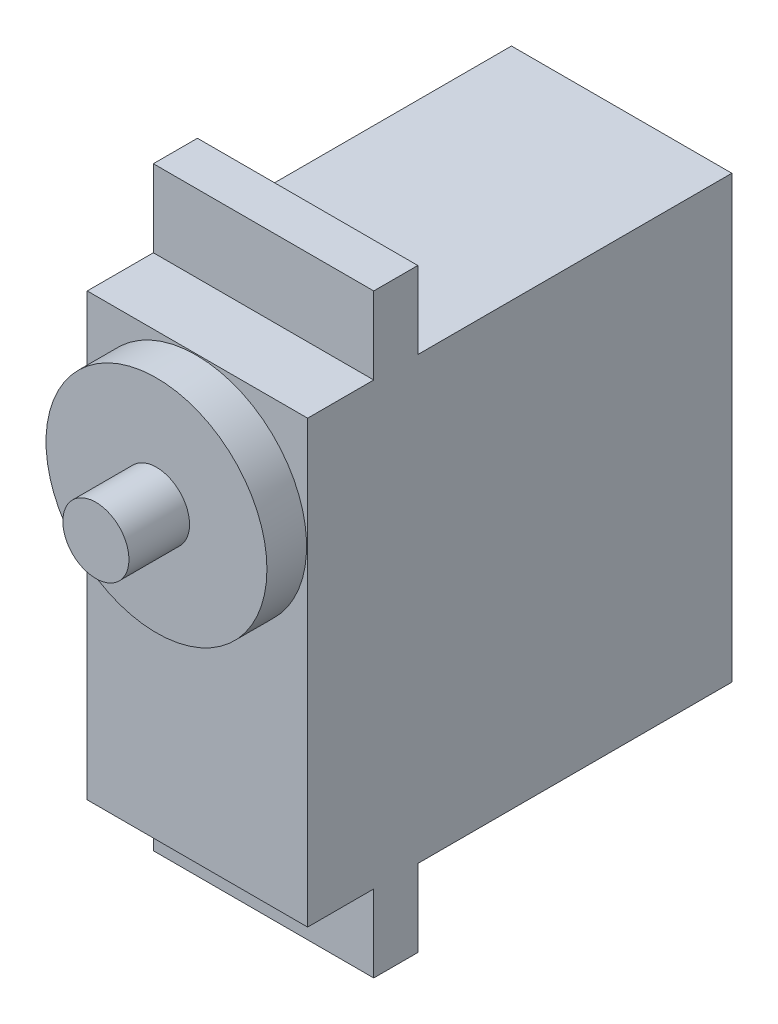
ISO-10303-21;
HEADER;
FILE_DESCRIPTION(('STEP AP214'),'2;1');
FILE_NAME('part.step','',(''),(''),'','','');
FILE_SCHEMA(('AUTOMOTIVE_DESIGN { 1 0 10303 214 1 1 1 1 }'));
ENDSEC;
DATA;
#1=APPLICATION_CONTEXT('core data for automotive mechanical design processes');
#2=APPLICATION_PROTOCOL_DEFINITION('international standard','automotive_design',2000,#1);
#3=PRODUCT_CONTEXT('',#1,'mechanical');
#4=PRODUCT('Part','Part','',(#3));
#5=PRODUCT_RELATED_PRODUCT_CATEGORY('part','',(#4));
#6=PRODUCT_DEFINITION_FORMATION('','',#4);
#7=PRODUCT_DEFINITION_CONTEXT('part definition',#1,'design');
#8=PRODUCT_DEFINITION('design','',#6,#7);
#9=PRODUCT_DEFINITION_SHAPE('','',#8);
#10=(LENGTH_UNIT() NAMED_UNIT(*) SI_UNIT(.MILLI.,.METRE.));
#11=(NAMED_UNIT(*) PLANE_ANGLE_UNIT() SI_UNIT($,.RADIAN.));
#12=(NAMED_UNIT(*) SI_UNIT($,.STERADIAN.) SOLID_ANGLE_UNIT());
#13=UNCERTAINTY_MEASURE_WITH_UNIT(LENGTH_MEASURE(1.E-05),#10,'distance_accuracy_value','');
#14=(GEOMETRIC_REPRESENTATION_CONTEXT(3) GLOBAL_UNCERTAINTY_ASSIGNED_CONTEXT((#13)) GLOBAL_UNIT_ASSIGNED_CONTEXT((#10,
#11,#12)) REPRESENTATION_CONTEXT('',''));
#15=CARTESIAN_POINT('',(0.,0.,0.));
#16=DIRECTION('',(0.,0.,1.));
#17=DIRECTION('',(1.,0.,0.));
#18=AXIS2_PLACEMENT_3D('',#15,#16,#17);
#19=CARTESIAN_POINT('',(0.,0.,0.));
#20=DIRECTION('',(0.,0.,1.));
#21=DIRECTION('',(1.,0.,0.));
#22=AXIS2_PLACEMENT_3D('',#19,#20,#21);
#23=PLANE('',#22);
#24=DIRECTION('',(-1.,0.,0.));
#25=VECTOR('',#24,1.);
#26=CARTESIAN_POINT('',(-9.99999999999999,-20.,0.));
#27=LINE('',#26,#25);
#28=CARTESIAN_POINT('',(10.,-20.,0.));
#29=VERTEX_POINT('',#28);
#30=CARTESIAN_POINT('',(-9.99999999999999,-20.,0.));
#31=VERTEX_POINT('',#30);
#32=EDGE_CURVE('E164',#29,#31,#27,.T.);
#33=ORIENTED_EDGE('',*,*,#32,.F.);
#34=DIRECTION('',(0.,1.,0.));
#35=VECTOR('',#34,1.);
#36=CARTESIAN_POINT('',(10.,-27.,0.));
#37=LINE('',#36,#35);
#38=CARTESIAN_POINT('',(10.,-27.,0.));
#39=VERTEX_POINT('',#38);
#40=EDGE_CURVE('E232',#39,#29,#37,.T.);
#41=ORIENTED_EDGE('',*,*,#40,.F.);
#42=DIRECTION('',(1.,0.,0.));
#43=VECTOR('',#42,1.);
#44=CARTESIAN_POINT('',(-9.99999999999999,-27.,0.));
#45=LINE('',#44,#43);
#46=CARTESIAN_POINT('',(-9.99999999999999,-27.,0.));
#47=VERTEX_POINT('',#46);
#48=EDGE_CURVE('E249',#47,#39,#45,.T.);
#49=ORIENTED_EDGE('',*,*,#48,.F.);
#50=DIRECTION('',(0.,-1.,0.));
#51=VECTOR('',#50,1.);
#52=CARTESIAN_POINT('',(-9.99999999999999,-27.,0.));
#53=LINE('',#52,#51);
#54=EDGE_CURVE('E63',#31,#47,#53,.T.);
#55=ORIENTED_EDGE('',*,*,#54,.F.);
#56=EDGE_LOOP('',(#33,#41,#49,#55));
#57=FACE_BOUND('',#56,.T.);
#58=ADVANCED_FACE('F45',(#57),#23,.F.);
#59=DIRECTION('',(1.,0.,0.));
#60=VECTOR('',#59,1.);
#61=CARTESIAN_POINT('',(-9.99999999999999,20.,0.));
#62=LINE('',#61,#60);
#63=CARTESIAN_POINT('',(-9.99999999999999,20.,0.));
#64=VERTEX_POINT('',#63);
#65=CARTESIAN_POINT('',(10.,20.,0.));
#66=VERTEX_POINT('',#65);
#67=EDGE_CURVE('E71',#64,#66,#62,.T.);
#68=ORIENTED_EDGE('',*,*,#67,.F.);
#69=CARTESIAN_POINT('',(-9.99999999999999,27.,0.));
#70=VERTEX_POINT('',#69);
#71=EDGE_CURVE('E168',#70,#64,#53,.T.);
#72=ORIENTED_EDGE('',*,*,#71,.F.);
#73=DIRECTION('',(-1.,0.,0.));
#74=VECTOR('',#73,1.);
#75=CARTESIAN_POINT('',(-9.99999999999999,27.,0.));
#76=LINE('',#75,#74);
#77=CARTESIAN_POINT('',(10.,27.,0.));
#78=VERTEX_POINT('',#77);
#79=EDGE_CURVE('E226',#78,#70,#76,.T.);
#80=ORIENTED_EDGE('',*,*,#79,.F.);
#81=EDGE_CURVE('E252',#66,#78,#37,.T.);
#82=ORIENTED_EDGE('',*,*,#81,.F.);
#83=EDGE_LOOP('',(#68,#72,#80,#82));
#84=FACE_BOUND('',#83,.T.);
#85=ADVANCED_FACE('F325',(#84),#23,.F.);
#86=CARTESIAN_POINT('',(0.,0.,4.));
#87=DIRECTION('',(0.,0.,1.));
#88=DIRECTION('',(1.,0.,0.));
#89=AXIS2_PLACEMENT_3D('',#86,#87,#88);
#90=PLANE('',#89);
#91=DIRECTION('',(-1.,0.,0.));
#92=VECTOR('',#91,1.);
#93=CARTESIAN_POINT('',(-9.99999999999999,20.,4.));
#94=LINE('',#93,#92);
#95=CARTESIAN_POINT('',(10.,20.,4.));
#96=VERTEX_POINT('',#95);
#97=CARTESIAN_POINT('',(-9.99999999999999,20.,4.));
#98=VERTEX_POINT('',#97);
#99=EDGE_CURVE('E207',#96,#98,#94,.T.);
#100=ORIENTED_EDGE('',*,*,#99,.F.);
#101=DIRECTION('',(0.,1.,0.));
#102=VECTOR('',#101,1.);
#103=CARTESIAN_POINT('',(10.,-27.,4.));
#104=LINE('',#103,#102);
#105=CARTESIAN_POINT('',(10.,27.,4.));
#106=VERTEX_POINT('',#105);
#107=EDGE_CURVE('E239',#96,#106,#104,.T.);
#108=ORIENTED_EDGE('',*,*,#107,.T.);
#109=DIRECTION('',(-1.,0.,0.));
#110=VECTOR('',#109,1.);
#111=CARTESIAN_POINT('',(-9.99999999999999,27.,4.));
#112=LINE('',#111,#110);
#113=CARTESIAN_POINT('',(-9.99999999999999,27.,4.));
#114=VERTEX_POINT('',#113);
#115=EDGE_CURVE('E227',#106,#114,#112,.T.);
#116=ORIENTED_EDGE('',*,*,#115,.T.);
#117=DIRECTION('',(0.,-1.,0.));
#118=VECTOR('',#117,1.);
#119=CARTESIAN_POINT('',(-9.99999999999999,-27.,4.));
#120=LINE('',#119,#118);
#121=EDGE_CURVE('E233',#114,#98,#120,.T.);
#122=ORIENTED_EDGE('',*,*,#121,.T.);
#123=EDGE_LOOP('',(#100,#108,#116,#122));
#124=FACE_BOUND('',#123,.T.);
#125=ADVANCED_FACE('F331',(#124),#90,.T.);
#126=CARTESIAN_POINT('',(-9.99999999999999,27.,4.));
#127=DIRECTION('',(0.,-1.,0.));
#128=DIRECTION('',(1.,0.,0.));
#129=AXIS2_PLACEMENT_3D('',#126,#127,#128);
#130=PLANE('',#129);
#131=ORIENTED_EDGE('',*,*,#79,.T.);
#132=DIRECTION('',(0.,0.,-1.));
#133=VECTOR('',#132,1.);
#134=CARTESIAN_POINT('',(-9.99999999999999,27.,4.));
#135=LINE('',#134,#133);
#136=EDGE_CURVE('E49',#114,#70,#135,.T.);
#137=ORIENTED_EDGE('',*,*,#136,.F.);
#138=ORIENTED_EDGE('',*,*,#115,.F.);
#139=DIRECTION('',(0.,0.,-1.));
#140=VECTOR('',#139,1.);
#141=CARTESIAN_POINT('',(10.,27.,4.));
#142=LINE('',#141,#140);
#143=EDGE_CURVE('E243',#106,#78,#142,.T.);
#144=ORIENTED_EDGE('',*,*,#143,.T.);
#145=EDGE_LOOP('',(#131,#137,#138,#144));
#146=FACE_BOUND('',#145,.T.);
#147=ADVANCED_FACE('F47',(#146),#130,.F.);
#148=CARTESIAN_POINT('',(-9.99999999999999,-27.,4.));
#149=DIRECTION('',(1.,0.,0.));
#150=DIRECTION('',(0.,0.,-1.));
#151=AXIS2_PLACEMENT_3D('',#148,#149,#150);
#152=PLANE('',#151);
#153=ORIENTED_EDGE('',*,*,#71,.T.);
#154=DIRECTION('',(0.,0.,1.));
#155=VECTOR('',#154,1.);
#156=CARTESIAN_POINT('',(-9.99999999999999,20.,-28.5));
#157=LINE('',#156,#155);
#158=CARTESIAN_POINT('',(-9.99999999999999,20.,-28.5));
#159=VERTEX_POINT('',#158);
#160=EDGE_CURVE('E147',#159,#64,#157,.T.);
#161=ORIENTED_EDGE('',*,*,#160,.F.);
#162=DIRECTION('',(0.,1.,0.));
#163=VECTOR('',#162,1.);
#164=CARTESIAN_POINT('',(-9.99999999999999,-20.,-28.5));
#165=LINE('',#164,#163);
#166=CARTESIAN_POINT('',(-9.99999999999999,-20.,-28.5));
#167=VERTEX_POINT('',#166);
#168=EDGE_CURVE('E154',#167,#159,#165,.T.);
#169=ORIENTED_EDGE('',*,*,#168,.F.);
#170=DIRECTION('',(0.,0.,1.));
#171=VECTOR('',#170,1.);
#172=CARTESIAN_POINT('',(-9.99999999999999,-20.,-28.5));
#173=LINE('',#172,#171);
#174=EDGE_CURVE('E296',#167,#31,#173,.T.);
#175=ORIENTED_EDGE('',*,*,#174,.T.);
#176=ORIENTED_EDGE('',*,*,#54,.T.);
#177=DIRECTION('',(0.,0.,-1.));
#178=VECTOR('',#177,1.);
#179=CARTESIAN_POINT('',(-9.99999999999999,-27.,4.));
#180=LINE('',#179,#178);
#181=CARTESIAN_POINT('',(-9.99999999999999,-27.,4.));
#182=VERTEX_POINT('',#181);
#183=EDGE_CURVE('E262',#182,#47,#180,.T.);
#184=ORIENTED_EDGE('',*,*,#183,.F.);
#185=CARTESIAN_POINT('',(-9.99999999999999,-20.,4.));
#186=VERTEX_POINT('',#185);
#187=EDGE_CURVE('E231',#186,#182,#120,.T.);
#188=ORIENTED_EDGE('',*,*,#187,.F.);
#189=DIRECTION('',(0.,0.,-1.));
#190=VECTOR('',#189,1.);
#191=CARTESIAN_POINT('',(-9.99999999999999,-20.,10.));
#192=LINE('',#191,#190);
#193=CARTESIAN_POINT('',(-9.99999999999999,-20.,10.));
#194=VERTEX_POINT('',#193);
#195=EDGE_CURVE('E222',#194,#186,#192,.T.);
#196=ORIENTED_EDGE('',*,*,#195,.F.);
#197=DIRECTION('',(0.,-1.,0.));
#198=VECTOR('',#197,1.);
#199=CARTESIAN_POINT('',(-9.99999999999999,20.,10.));
#200=LINE('',#199,#198);
#201=CARTESIAN_POINT('',(-9.99999999999999,8.21388537958543,10.));
#202=VERTEX_POINT('',#201);
#203=EDGE_CURVE('E194',#202,#194,#200,.T.);
#204=ORIENTED_EDGE('',*,*,#203,.F.);
#205=CARTESIAN_POINT('',(-9.99999999999999,11.5549903092419,10.));
#206=VERTEX_POINT('',#205);
#207=EDGE_CURVE('E193',#206,#202,#200,.T.);
#208=ORIENTED_EDGE('',*,*,#207,.F.);
#209=CARTESIAN_POINT('',(-9.99999999999999,20.,10.));
#210=VERTEX_POINT('',#209);
#211=EDGE_CURVE('E189',#210,#206,#200,.T.);
#212=ORIENTED_EDGE('',*,*,#211,.F.);
#213=DIRECTION('',(0.,0.,-1.));
#214=VECTOR('',#213,1.);
#215=CARTESIAN_POINT('',(-9.99999999999999,20.,10.));
#216=LINE('',#215,#214);
#217=EDGE_CURVE('E203',#210,#98,#216,.T.);
#218=ORIENTED_EDGE('',*,*,#217,.T.);
#219=ORIENTED_EDGE('',*,*,#121,.F.);
#220=ORIENTED_EDGE('',*,*,#136,.T.);
#221=EDGE_LOOP('',(#153,#161,#169,#175,#176,#184,#188,#196,#204,#208,#212,#218,#219,#220));
#222=FACE_BOUND('',#221,.T.);
#223=ADVANCED_FACE('F166',(#222),#152,.F.);
#224=CARTESIAN_POINT('',(-9.99999999999999,-27.,4.));
#225=DIRECTION('',(0.,1.,0.));
#226=DIRECTION('',(-1.,0.,0.));
#227=AXIS2_PLACEMENT_3D('',#224,#225,#226);
#228=PLANE('',#227);
#229=ORIENTED_EDGE('',*,*,#48,.T.);
#230=DIRECTION('',(0.,0.,-1.));
#231=VECTOR('',#230,1.);
#232=CARTESIAN_POINT('',(10.,-27.,4.));
#233=LINE('',#232,#231);
#234=CARTESIAN_POINT('',(10.,-27.,4.));
#235=VERTEX_POINT('',#234);
#236=EDGE_CURVE('E259',#235,#39,#233,.T.);
#237=ORIENTED_EDGE('',*,*,#236,.F.);
#238=DIRECTION('',(1.,0.,0.));
#239=VECTOR('',#238,1.);
#240=CARTESIAN_POINT('',(-9.99999999999999,-27.,4.));
#241=LINE('',#240,#239);
#242=EDGE_CURVE('E236',#182,#235,#241,.T.);
#243=ORIENTED_EDGE('',*,*,#242,.F.);
#244=ORIENTED_EDGE('',*,*,#183,.T.);
#245=EDGE_LOOP('',(#229,#237,#243,#244));
#246=FACE_BOUND('',#245,.T.);
#247=ADVANCED_FACE('F338',(#246),#228,.F.);
#248=CARTESIAN_POINT('',(10.,-27.,4.));
#249=DIRECTION('',(-1.,0.,0.));
#250=DIRECTION('',(0.,0.,1.));
#251=AXIS2_PLACEMENT_3D('',#248,#249,#250);
#252=PLANE('',#251);
#253=ORIENTED_EDGE('',*,*,#40,.T.);
#254=DIRECTION('',(0.,0.,1.));
#255=VECTOR('',#254,1.);
#256=CARTESIAN_POINT('',(10.,-20.,-28.5));
#257=LINE('',#256,#255);
#258=CARTESIAN_POINT('',(10.,-20.,-28.5));
#259=VERTEX_POINT('',#258);
#260=EDGE_CURVE('E177',#259,#29,#257,.T.);
#261=ORIENTED_EDGE('',*,*,#260,.F.);
#262=DIRECTION('',(0.,-1.,0.));
#263=VECTOR('',#262,1.);
#264=CARTESIAN_POINT('',(10.,-20.,-28.5));
#265=LINE('',#264,#263);
#266=CARTESIAN_POINT('',(10.,20.,-28.5));
#267=VERTEX_POINT('',#266);
#268=EDGE_CURVE('E153',#267,#259,#265,.T.);
#269=ORIENTED_EDGE('',*,*,#268,.F.);
#270=DIRECTION('',(0.,0.,1.));
#271=VECTOR('',#270,1.);
#272=CARTESIAN_POINT('',(10.,20.,-28.5));
#273=LINE('',#272,#271);
#274=EDGE_CURVE('E149',#267,#66,#273,.T.);
#275=ORIENTED_EDGE('',*,*,#274,.T.);
#276=ORIENTED_EDGE('',*,*,#81,.T.);
#277=ORIENTED_EDGE('',*,*,#143,.F.);
#278=ORIENTED_EDGE('',*,*,#107,.F.);
#279=DIRECTION('',(0.,0.,-1.));
#280=VECTOR('',#279,1.);
#281=CARTESIAN_POINT('',(10.,20.,10.));
#282=LINE('',#281,#280);
#283=CARTESIAN_POINT('',(10.,20.,10.));
#284=VERTEX_POINT('',#283);
#285=EDGE_CURVE('E214',#284,#96,#282,.T.);
#286=ORIENTED_EDGE('',*,*,#285,.F.);
#287=DIRECTION('',(0.,1.,0.));
#288=VECTOR('',#287,1.);
#289=CARTESIAN_POINT('',(10.,20.,10.));
#290=LINE('',#289,#288);
#291=CARTESIAN_POINT('',(10.,-20.,10.));
#292=VERTEX_POINT('',#291);
#293=EDGE_CURVE('E197',#292,#284,#290,.T.);
#294=ORIENTED_EDGE('',*,*,#293,.F.);
#295=DIRECTION('',(0.,0.,-1.));
#296=VECTOR('',#295,1.);
#297=CARTESIAN_POINT('',(10.,-20.,10.));
#298=LINE('',#297,#296);
#299=CARTESIAN_POINT('',(10.,-20.,4.));
#300=VERTEX_POINT('',#299);
#301=EDGE_CURVE('E218',#292,#300,#298,.T.);
#302=ORIENTED_EDGE('',*,*,#301,.T.);
#303=EDGE_CURVE('E240',#235,#300,#104,.T.);
#304=ORIENTED_EDGE('',*,*,#303,.F.);
#305=ORIENTED_EDGE('',*,*,#236,.T.);
#306=EDGE_LOOP('',(#253,#261,#269,#275,#276,#277,#278,#286,#294,#302,#304,#305));
#307=FACE_BOUND('',#306,.T.);
#308=ADVANCED_FACE('F312',(#307),#252,.F.);
#309=DIRECTION('',(1.,0.,0.));
#310=VECTOR('',#309,1.);
#311=CARTESIAN_POINT('',(-9.99999999999999,-20.,4.));
#312=LINE('',#311,#310);
#313=EDGE_CURVE('E185',#186,#300,#312,.T.);
#314=ORIENTED_EDGE('',*,*,#313,.F.);
#315=ORIENTED_EDGE('',*,*,#187,.T.);
#316=ORIENTED_EDGE('',*,*,#242,.T.);
#317=ORIENTED_EDGE('',*,*,#303,.T.);
#318=EDGE_LOOP('',(#314,#315,#316,#317));
#319=FACE_BOUND('',#318,.T.);
#320=ADVANCED_FACE('F334',(#319),#90,.T.);
#321=CARTESIAN_POINT('',(-9.99999999999999,-20.,10.));
#322=DIRECTION('',(0.,1.,0.));
#323=DIRECTION('',(0.,0.,1.));
#324=AXIS2_PLACEMENT_3D('',#321,#322,#323);
#325=PLANE('',#324);
#326=ORIENTED_EDGE('',*,*,#313,.T.);
#327=ORIENTED_EDGE('',*,*,#301,.F.);
#328=DIRECTION('',(1.,0.,0.));
#329=VECTOR('',#328,1.);
#330=CARTESIAN_POINT('',(-9.99999999999999,-20.,10.));
#331=LINE('',#330,#329);
#332=EDGE_CURVE('E192',#194,#292,#331,.T.);
#333=ORIENTED_EDGE('',*,*,#332,.F.);
#334=ORIENTED_EDGE('',*,*,#195,.T.);
#335=EDGE_LOOP('',(#326,#327,#333,#334));
#336=FACE_BOUND('',#335,.T.);
#337=ADVANCED_FACE('F289',(#336),#325,.F.);
#338=CARTESIAN_POINT('',(-9.99999999999999,20.,10.));
#339=DIRECTION('',(0.,-1.,0.));
#340=DIRECTION('',(0.,0.,-1.));
#341=AXIS2_PLACEMENT_3D('',#338,#339,#340);
#342=PLANE('',#341);
#343=ORIENTED_EDGE('',*,*,#99,.T.);
#344=ORIENTED_EDGE('',*,*,#217,.F.);
#345=DIRECTION('',(-1.,0.,0.));
#346=VECTOR('',#345,1.);
#347=CARTESIAN_POINT('',(-9.99999999999999,20.,10.));
#348=LINE('',#347,#346);
#349=EDGE_CURVE('E200',#284,#210,#348,.T.);
#350=ORIENTED_EDGE('',*,*,#349,.F.);
#351=ORIENTED_EDGE('',*,*,#285,.T.);
#352=EDGE_LOOP('',(#343,#344,#350,#351));
#353=FACE_BOUND('',#352,.T.);
#354=ADVANCED_FACE('F357',(#353),#342,.F.);
#355=CARTESIAN_POINT('',(0.,0.,10.));
#356=DIRECTION('',(0.,0.,1.));
#357=DIRECTION('',(1.,0.,0.));
#358=AXIS2_PLACEMENT_3D('',#355,#356,#357);
#359=PLANE('',#358);
#360=CARTESIAN_POINT('',(-0.116229886176514,9.88443784441367,10.));
#361=DIRECTION('',(0.,0.,1.));
#362=DIRECTION('',(1.,0.,0.));
#363=AXIS2_PLACEMENT_3D('',#360,#361,#362);
#364=CIRCLE('',#363,10.0239541699199);
#365=EDGE_CURVE('E55',#202,#206,#364,.T.);
#366=ORIENTED_EDGE('',*,*,#365,.F.);
#367=ORIENTED_EDGE('',*,*,#203,.T.);
#368=ORIENTED_EDGE('',*,*,#332,.T.);
#369=ORIENTED_EDGE('',*,*,#293,.T.);
#370=ORIENTED_EDGE('',*,*,#349,.T.);
#371=ORIENTED_EDGE('',*,*,#211,.T.);
#372=EDGE_LOOP('',(#366,#367,#368,#369,#370,#371));
#373=FACE_BOUND('',#372,.T.);
#374=ADVANCED_FACE('F285',(#373),#359,.T.);
#375=CARTESIAN_POINT('',(-0.116229886176514,9.88443784441367,10.));
#376=DIRECTION('',(0.,0.,1.));
#377=DIRECTION('',(1.,0.,0.));
#378=AXIS2_PLACEMENT_3D('',#375,#376,#377);
#379=PLANE('',#378);
#380=EDGE_CURVE('E175',#206,#202,#364,.T.);
#381=ORIENTED_EDGE('',*,*,#380,.F.);
#382=ORIENTED_EDGE('',*,*,#207,.T.);
#383=EDGE_LOOP('',(#381,#382));
#384=FACE_BOUND('',#383,.T.);
#385=ADVANCED_FACE('F279',(#384),#379,.F.);
#386=CARTESIAN_POINT('',(-0.116229886176514,9.88443784441367,13.6));
#387=DIRECTION('',(0.,0.,-1.));
#388=DIRECTION('',(-1.,0.,0.));
#389=AXIS2_PLACEMENT_3D('',#386,#387,#388);
#390=CYLINDRICAL_SURFACE('',#389,10.0239541699199);
#391=CARTESIAN_POINT('',(-0.116229886176514,9.88443784441367,13.6));
#392=DIRECTION('',(0.,0.,1.));
#393=DIRECTION('',(1.,0.,0.));
#394=AXIS2_PLACEMENT_3D('',#391,#392,#393);
#395=CIRCLE('',#394,10.0239541699199);
#396=CARTESIAN_POINT('',(9.90772428374335,9.88443784441367,13.6));
#397=VERTEX_POINT('',#396);
#398=EDGE_CURVE('E181',#397,#397,#395,.T.);
#399=ORIENTED_EDGE('',*,*,#398,.F.);
#400=EDGE_LOOP('',(#399));
#401=FACE_BOUND('',#400,.T.);
#402=ORIENTED_EDGE('',*,*,#380,.T.);
#403=ORIENTED_EDGE('',*,*,#365,.T.);
#404=EDGE_LOOP('',(#402,#403));
#405=FACE_BOUND('',#404,.T.);
#406=ADVANCED_FACE('F274',(#401,#405),#390,.T.);
#407=CARTESIAN_POINT('',(-0.116229886176514,9.88443784441367,13.6));
#408=DIRECTION('',(0.,0.,1.));
#409=DIRECTION('',(1.,0.,0.));
#410=AXIS2_PLACEMENT_3D('',#407,#408,#409);
#411=PLANE('',#410);
#412=CARTESIAN_POINT('',(-0.116229886176514,9.88443784441367,13.6));
#413=DIRECTION('',(0.,0.,1.));
#414=DIRECTION('',(1.,0.,0.));
#415=AXIS2_PLACEMENT_3D('',#412,#413,#414);
#416=CIRCLE('',#415,3.);
#417=CARTESIAN_POINT('',(2.88377011382349,9.88443784441367,13.6));
#418=VERTEX_POINT('',#417);
#419=EDGE_CURVE('E11',#418,#418,#416,.T.);
#420=ORIENTED_EDGE('',*,*,#419,.F.);
#421=EDGE_LOOP('',(#420));
#422=FACE_BOUND('',#421,.T.);
#423=ORIENTED_EDGE('',*,*,#398,.T.);
#424=EDGE_LOOP('',(#423));
#425=FACE_BOUND('',#424,.T.);
#426=ADVANCED_FACE('F374',(#422,#425),#411,.T.);
#427=CARTESIAN_POINT('',(-0.116229886176514,9.88443784441367,19.1));
#428=DIRECTION('',(0.,0.,-1.));
#429=DIRECTION('',(-1.,0.,0.));
#430=AXIS2_PLACEMENT_3D('',#427,#428,#429);
#431=CYLINDRICAL_SURFACE('',#430,3.);
#432=CARTESIAN_POINT('',(-0.116229886176514,9.88443784441367,19.1));
#433=DIRECTION('',(0.,0.,1.));
#434=DIRECTION('',(1.,0.,0.));
#435=AXIS2_PLACEMENT_3D('',#432,#433,#434);
#436=CIRCLE('',#435,3.);
#437=CARTESIAN_POINT('',(2.88377011382349,9.88443784441367,19.1));
#438=VERTEX_POINT('',#437);
#439=EDGE_CURVE('E170',#438,#438,#436,.T.);
#440=ORIENTED_EDGE('',*,*,#439,.F.);
#441=EDGE_LOOP('',(#440));
#442=FACE_BOUND('',#441,.T.);
#443=ORIENTED_EDGE('',*,*,#419,.T.);
#444=EDGE_LOOP('',(#443));
#445=FACE_BOUND('',#444,.T.);
#446=ADVANCED_FACE('F380',(#442,#445),#431,.T.);
#447=CARTESIAN_POINT('',(-0.116229886176514,9.88443784441367,19.1));
#448=DIRECTION('',(0.,0.,1.));
#449=DIRECTION('',(1.,0.,0.));
#450=AXIS2_PLACEMENT_3D('',#447,#448,#449);
#451=PLANE('',#450);
#452=ORIENTED_EDGE('',*,*,#439,.T.);
#453=EDGE_LOOP('',(#452));
#454=FACE_BOUND('',#453,.T.);
#455=ADVANCED_FACE('F322',(#454),#451,.T.);
#456=CARTESIAN_POINT('',(-9.99999999999999,20.,-28.5));
#457=DIRECTION('',(0.,-1.,0.));
#458=DIRECTION('',(0.,0.,-1.));
#459=AXIS2_PLACEMENT_3D('',#456,#457,#458);
#460=PLANE('',#459);
#461=ORIENTED_EDGE('',*,*,#67,.T.);
#462=ORIENTED_EDGE('',*,*,#274,.F.);
#463=DIRECTION('',(1.,0.,0.));
#464=VECTOR('',#463,1.);
#465=CARTESIAN_POINT('',(-9.99999999999999,20.,-28.5));
#466=LINE('',#465,#464);
#467=EDGE_CURVE('E143',#159,#267,#466,.T.);
#468=ORIENTED_EDGE('',*,*,#467,.F.);
#469=ORIENTED_EDGE('',*,*,#160,.T.);
#470=EDGE_LOOP('',(#461,#462,#468,#469));
#471=FACE_BOUND('',#470,.T.);
#472=ADVANCED_FACE('F145',(#471),#460,.F.);
#473=CARTESIAN_POINT('',(-9.99999999999999,-20.,-28.5));
#474=DIRECTION('',(0.,1.,0.));
#475=DIRECTION('',(0.,0.,1.));
#476=AXIS2_PLACEMENT_3D('',#473,#474,#475);
#477=PLANE('',#476);
#478=ORIENTED_EDGE('',*,*,#32,.T.);
#479=ORIENTED_EDGE('',*,*,#174,.F.);
#480=DIRECTION('',(-1.,0.,0.));
#481=VECTOR('',#480,1.);
#482=CARTESIAN_POINT('',(-9.99999999999999,-20.,-28.5));
#483=LINE('',#482,#481);
#484=EDGE_CURVE('E159',#259,#167,#483,.T.);
#485=ORIENTED_EDGE('',*,*,#484,.F.);
#486=ORIENTED_EDGE('',*,*,#260,.T.);
#487=EDGE_LOOP('',(#478,#479,#485,#486));
#488=FACE_BOUND('',#487,.T.);
#489=ADVANCED_FACE('F314',(#488),#477,.F.);
#490=CARTESIAN_POINT('',(0.,0.,-28.5));
#491=DIRECTION('',(0.,0.,-1.));
#492=DIRECTION('',(-1.,0.,0.));
#493=AXIS2_PLACEMENT_3D('',#490,#491,#492);
#494=PLANE('',#493);
#495=ORIENTED_EDGE('',*,*,#168,.T.);
#496=ORIENTED_EDGE('',*,*,#467,.T.);
#497=ORIENTED_EDGE('',*,*,#268,.T.);
#498=ORIENTED_EDGE('',*,*,#484,.T.);
#499=EDGE_LOOP('',(#495,#496,#497,#498));
#500=FACE_BOUND('',#499,.T.);
#501=ADVANCED_FACE('F157',(#500),#494,.T.);
#502=CLOSED_SHELL('',(#58,#85,#125,#147,#223,#247,#308,#320,#337,#354,#374,#385,#406,#426,#446,
#455,#472,#489,#501));
#503=MANIFOLD_SOLID_BREP('B2',#502);
#504=ADVANCED_BREP_SHAPE_REPRESENTATION('',(#18,#503),#14);
#505=SHAPE_DEFINITION_REPRESENTATION(#9,#504);
ENDSEC;
END-ISO-10303-21;
